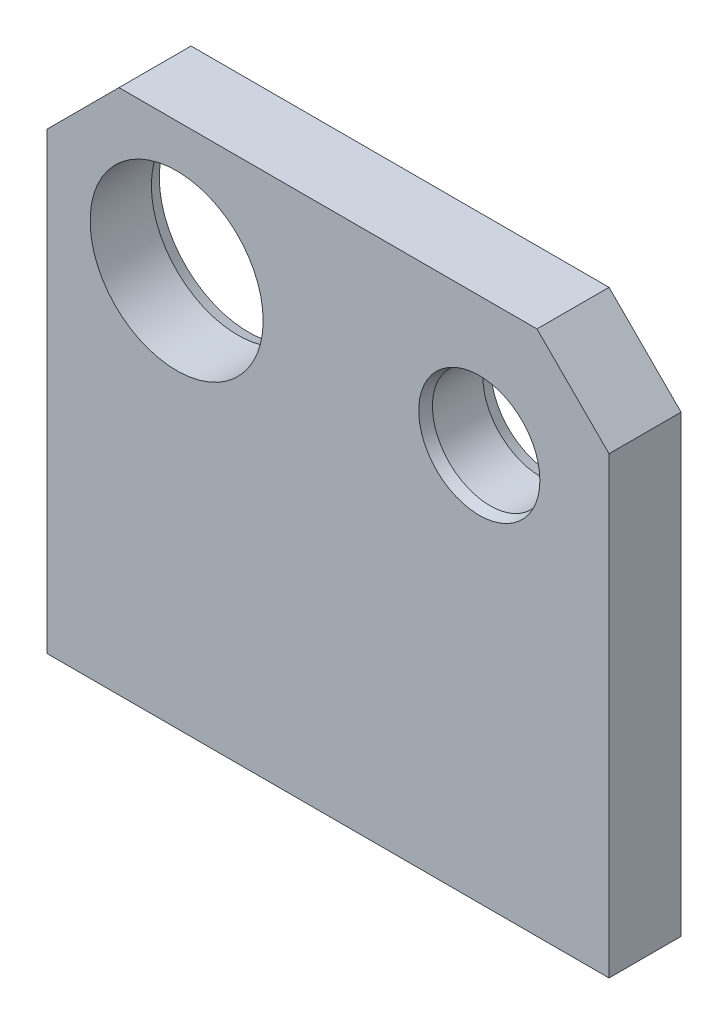
ISO-10303-21;
HEADER;
FILE_DESCRIPTION(('STEP AP214'),'2;1');
FILE_NAME('part.step','',(''),(''),'','','');
FILE_SCHEMA(('AUTOMOTIVE_DESIGN { 1 0 10303 214 1 1 1 1 }'));
ENDSEC;
DATA;
#1=APPLICATION_CONTEXT('core data for automotive mechanical design processes');
#2=APPLICATION_PROTOCOL_DEFINITION('international standard','automotive_design',2000,#1);
#3=PRODUCT_CONTEXT('',#1,'mechanical');
#4=PRODUCT('Part','Part','',(#3));
#5=PRODUCT_RELATED_PRODUCT_CATEGORY('part','',(#4));
#6=PRODUCT_DEFINITION_FORMATION('','',#4);
#7=PRODUCT_DEFINITION_CONTEXT('part definition',#1,'design');
#8=PRODUCT_DEFINITION('design','',#6,#7);
#9=PRODUCT_DEFINITION_SHAPE('','',#8);
#10=(LENGTH_UNIT() NAMED_UNIT(*) SI_UNIT(.MILLI.,.METRE.));
#11=(NAMED_UNIT(*) PLANE_ANGLE_UNIT() SI_UNIT($,.RADIAN.));
#12=(NAMED_UNIT(*) SI_UNIT($,.STERADIAN.) SOLID_ANGLE_UNIT());
#13=UNCERTAINTY_MEASURE_WITH_UNIT(LENGTH_MEASURE(1.E-05),#10,'distance_accuracy_value','');
#14=(GEOMETRIC_REPRESENTATION_CONTEXT(3) GLOBAL_UNCERTAINTY_ASSIGNED_CONTEXT((#13)) GLOBAL_UNIT_ASSIGNED_CONTEXT((#10,
#11,#12)) REPRESENTATION_CONTEXT('',''));
#15=CARTESIAN_POINT('',(0.,0.,0.));
#16=DIRECTION('',(0.,0.,1.));
#17=DIRECTION('',(1.,0.,0.));
#18=AXIS2_PLACEMENT_3D('',#15,#16,#17);
#19=CARTESIAN_POINT('',(0.,0.,9.99999999999999));
#20=DIRECTION('',(1.,0.,0.));
#21=DIRECTION('',(0.,0.,-1.));
#22=AXIS2_PLACEMENT_3D('',#19,#20,#21);
#23=PLANE('',#22);
#24=DIRECTION('',(0.,-1.,0.));
#25=VECTOR('',#24,1.);
#26=CARTESIAN_POINT('',(0.,0.,9.99999999999999));
#27=LINE('',#26,#25);
#28=CARTESIAN_POINT('',(0.,63.,9.99999999999999));
#29=VERTEX_POINT('',#28);
#30=CARTESIAN_POINT('',(0.,0.,9.99999999999999));
#31=VERTEX_POINT('',#30);
#32=EDGE_CURVE('E119',#29,#31,#27,.T.);
#33=ORIENTED_EDGE('',*,*,#32,.F.);
#34=DIRECTION('',(0.,0.,-1.));
#35=VECTOR('',#34,1.);
#36=CARTESIAN_POINT('',(0.,63.,9.99999999999999));
#37=LINE('',#36,#35);
#38=CARTESIAN_POINT('',(0.,63.,0.));
#39=VERTEX_POINT('',#38);
#40=EDGE_CURVE('E154',#29,#39,#37,.T.);
#41=ORIENTED_EDGE('',*,*,#40,.T.);
#42=DIRECTION('',(0.,-1.,0.));
#43=VECTOR('',#42,1.);
#44=CARTESIAN_POINT('',(0.,0.,0.));
#45=LINE('',#44,#43);
#46=CARTESIAN_POINT('',(0.,0.,0.));
#47=VERTEX_POINT('',#46);
#48=EDGE_CURVE('E118',#39,#47,#45,.T.);
#49=ORIENTED_EDGE('',*,*,#48,.T.);
#50=DIRECTION('',(0.,0.,-1.));
#51=VECTOR('',#50,1.);
#52=CARTESIAN_POINT('',(0.,0.,9.99999999999999));
#53=LINE('',#52,#51);
#54=EDGE_CURVE('E138',#31,#47,#53,.T.);
#55=ORIENTED_EDGE('',*,*,#54,.F.);
#56=EDGE_LOOP('',(#33,#41,#49,#55));
#57=FACE_BOUND('',#56,.T.);
#58=ADVANCED_FACE('F34',(#57),#23,.F.);
#59=CARTESIAN_POINT('',(0.,0.,9.99999999999999));
#60=DIRECTION('',(0.,1.,0.));
#61=DIRECTION('',(0.,0.,1.));
#62=AXIS2_PLACEMENT_3D('',#59,#60,#61);
#63=PLANE('',#62);
#64=CARTESIAN_POINT('',(5.,0.,5.));
#65=DIRECTION('',(0.,-1.,0.));
#66=DIRECTION('',(0.,0.,-1.));
#67=AXIS2_PLACEMENT_3D('',#64,#65,#66);
#68=CIRCLE('',#67,2.5);
#69=CARTESIAN_POINT('',(5.,0.,2.5));
#70=VERTEX_POINT('',#69);
#71=EDGE_CURVE('E105',#70,#70,#68,.T.);
#72=ORIENTED_EDGE('',*,*,#71,.F.);
#73=EDGE_LOOP('',(#72));
#74=FACE_BOUND('',#73,.T.);
#75=CARTESIAN_POINT('',(73.,0.,5.));
#76=DIRECTION('',(0.,-1.,0.));
#77=DIRECTION('',(0.,0.,-1.));
#78=AXIS2_PLACEMENT_3D('',#75,#76,#77);
#79=CIRCLE('',#78,2.5);
#80=CARTESIAN_POINT('',(73.,0.,2.5));
#81=VERTEX_POINT('',#80);
#82=EDGE_CURVE('E104',#81,#81,#79,.T.);
#83=ORIENTED_EDGE('',*,*,#82,.F.);
#84=EDGE_LOOP('',(#83));
#85=FACE_BOUND('',#84,.T.);
#86=DIRECTION('',(1.,0.,0.));
#87=VECTOR('',#86,1.);
#88=CARTESIAN_POINT('',(0.,0.,0.));
#89=LINE('',#88,#87);
#90=CARTESIAN_POINT('',(78.,0.,0.));
#91=VERTEX_POINT('',#90);
#92=EDGE_CURVE('E130',#47,#91,#89,.T.);
#93=ORIENTED_EDGE('',*,*,#92,.T.);
#94=DIRECTION('',(0.,0.,-1.));
#95=VECTOR('',#94,1.);
#96=CARTESIAN_POINT('',(78.,0.,9.99999999999999));
#97=LINE('',#96,#95);
#98=CARTESIAN_POINT('',(78.,0.,9.99999999999999));
#99=VERTEX_POINT('',#98);
#100=EDGE_CURVE('E128',#99,#91,#97,.T.);
#101=ORIENTED_EDGE('',*,*,#100,.F.);
#102=DIRECTION('',(1.,0.,0.));
#103=VECTOR('',#102,1.);
#104=CARTESIAN_POINT('',(0.,0.,9.99999999999999));
#105=LINE('',#104,#103);
#106=EDGE_CURVE('E121',#31,#99,#105,.T.);
#107=ORIENTED_EDGE('',*,*,#106,.F.);
#108=ORIENTED_EDGE('',*,*,#54,.T.);
#109=EDGE_LOOP('',(#93,#101,#107,#108));
#110=FACE_BOUND('',#109,.T.);
#111=ADVANCED_FACE('F184',(#74,#85,#110),#63,.F.);
#112=CARTESIAN_POINT('',(78.,0.,9.99999999999999));
#113=DIRECTION('',(-1.,0.,0.));
#114=DIRECTION('',(0.,0.,1.));
#115=AXIS2_PLACEMENT_3D('',#112,#113,#114);
#116=PLANE('',#115);
#117=DIRECTION('',(0.,1.,0.));
#118=VECTOR('',#117,1.);
#119=CARTESIAN_POINT('',(78.,0.,0.));
#120=LINE('',#119,#118);
#121=CARTESIAN_POINT('',(78.,63.,0.));
#122=VERTEX_POINT('',#121);
#123=EDGE_CURVE('E132',#91,#122,#120,.T.);
#124=ORIENTED_EDGE('',*,*,#123,.T.);
#125=DIRECTION('',(0.,0.,1.));
#126=VECTOR('',#125,1.);
#127=CARTESIAN_POINT('',(78.,63.,9.99999999999999));
#128=LINE('',#127,#126);
#129=CARTESIAN_POINT('',(78.,62.9999999999999,9.99999999999999));
#130=VERTEX_POINT('',#129);
#131=EDGE_CURVE('E57',#122,#130,#128,.T.);
#132=ORIENTED_EDGE('',*,*,#131,.T.);
#133=DIRECTION('',(0.,1.,0.));
#134=VECTOR('',#133,1.);
#135=CARTESIAN_POINT('',(78.,0.,9.99999999999999));
#136=LINE('',#135,#134);
#137=EDGE_CURVE('E124',#99,#130,#136,.T.);
#138=ORIENTED_EDGE('',*,*,#137,.F.);
#139=ORIENTED_EDGE('',*,*,#100,.T.);
#140=EDGE_LOOP('',(#124,#132,#138,#139));
#141=FACE_BOUND('',#140,.T.);
#142=ADVANCED_FACE('F190',(#141),#116,.F.);
#143=CARTESIAN_POINT('',(0.,73.,9.99999999999999));
#144=DIRECTION('',(0.,-1.,0.));
#145=DIRECTION('',(0.,0.,-1.));
#146=AXIS2_PLACEMENT_3D('',#143,#144,#145);
#147=PLANE('',#146);
#148=DIRECTION('',(-1.,0.,0.));
#149=VECTOR('',#148,1.);
#150=CARTESIAN_POINT('',(0.,73.,9.99999999999999));
#151=LINE('',#150,#149);
#152=CARTESIAN_POINT('',(68.,73.,9.99999999999999));
#153=VERTEX_POINT('',#152);
#154=CARTESIAN_POINT('',(10.,73.,9.99999999999999));
#155=VERTEX_POINT('',#154);
#156=EDGE_CURVE('E126',#153,#155,#151,.T.);
#157=ORIENTED_EDGE('',*,*,#156,.F.);
#158=DIRECTION('',(0.,0.,-1.));
#159=VECTOR('',#158,1.);
#160=CARTESIAN_POINT('',(68.,73.,9.99999999999999));
#161=LINE('',#160,#159);
#162=CARTESIAN_POINT('',(68.,73.,0.));
#163=VERTEX_POINT('',#162);
#164=EDGE_CURVE('E143',#153,#163,#161,.T.);
#165=ORIENTED_EDGE('',*,*,#164,.T.);
#166=DIRECTION('',(-1.,0.,0.));
#167=VECTOR('',#166,1.);
#168=CARTESIAN_POINT('',(0.,73.,0.));
#169=LINE('',#168,#167);
#170=CARTESIAN_POINT('',(10.,73.,0.));
#171=VERTEX_POINT('',#170);
#172=EDGE_CURVE('E122',#163,#171,#169,.T.);
#173=ORIENTED_EDGE('',*,*,#172,.T.);
#174=DIRECTION('',(0.,0.,1.));
#175=VECTOR('',#174,1.);
#176=CARTESIAN_POINT('',(10.,73.,9.99999999999999));
#177=LINE('',#176,#175);
#178=EDGE_CURVE('E141',#171,#155,#177,.T.);
#179=ORIENTED_EDGE('',*,*,#178,.T.);
#180=EDGE_LOOP('',(#157,#165,#173,#179));
#181=FACE_BOUND('',#180,.T.);
#182=ADVANCED_FACE('F225',(#181),#147,.F.);
#183=CARTESIAN_POINT('',(0.,73.,9.99999999999999));
#184=DIRECTION('',(0.,0.,-1.));
#185=DIRECTION('',(-1.,0.,0.));
#186=AXIS2_PLACEMENT_3D('',#183,#184,#185);
#187=PLANE('',#186);
#188=CARTESIAN_POINT('',(60.,55.,9.99999999999999));
#189=DIRECTION('',(0.,0.,-1.));
#190=DIRECTION('',(-1.,0.,0.));
#191=AXIS2_PLACEMENT_3D('',#188,#189,#190);
#192=CIRCLE('',#191,8.40642378864666);
#193=CARTESIAN_POINT('',(68.4064237886467,55.,10.));
#194=VERTEX_POINT('',#193);
#195=EDGE_CURVE('E11',#194,#194,#192,.T.);
#196=ORIENTED_EDGE('',*,*,#195,.T.);
#197=EDGE_LOOP('',(#196));
#198=FACE_BOUND('',#197,.T.);
#199=CARTESIAN_POINT('',(18.,55.,9.99999999999999));
#200=DIRECTION('',(0.,0.,1.));
#201=DIRECTION('',(1.,0.,0.));
#202=AXIS2_PLACEMENT_3D('',#199,#200,#201);
#203=CIRCLE('',#202,12.0065);
#204=CARTESIAN_POINT('',(30.0065,55.,9.99999999999999));
#205=VERTEX_POINT('',#204);
#206=EDGE_CURVE('E115',#205,#205,#203,.T.);
#207=ORIENTED_EDGE('',*,*,#206,.F.);
#208=EDGE_LOOP('',(#207));
#209=FACE_BOUND('',#208,.T.);
#210=ORIENTED_EDGE('',*,*,#137,.T.);
#211=DIRECTION('',(0.707106781186546,-0.70710678118655,0.));
#212=VECTOR('',#211,1.);
#213=CARTESIAN_POINT('',(68.,73.,9.99999999999999));
#214=LINE('',#213,#212);
#215=EDGE_CURVE('E152',#130,#153,#214,.F.);
#216=ORIENTED_EDGE('',*,*,#215,.T.);
#217=ORIENTED_EDGE('',*,*,#156,.T.);
#218=DIRECTION('',(0.70710678118655,0.707106781186546,0.));
#219=VECTOR('',#218,1.);
#220=CARTESIAN_POINT('',(0.,63.,9.99999999999999));
#221=LINE('',#220,#219);
#222=EDGE_CURVE('E49',#155,#29,#221,.F.);
#223=ORIENTED_EDGE('',*,*,#222,.T.);
#224=ORIENTED_EDGE('',*,*,#32,.T.);
#225=ORIENTED_EDGE('',*,*,#106,.T.);
#226=EDGE_LOOP('',(#210,#216,#217,#223,#224,#225));
#227=FACE_BOUND('',#226,.T.);
#228=ADVANCED_FACE('F215',(#198,#209,#227),#187,.F.);
#229=CARTESIAN_POINT('',(0.,73.,0.));
#230=DIRECTION('',(0.,0.,-1.));
#231=DIRECTION('',(-1.,0.,0.));
#232=AXIS2_PLACEMENT_3D('',#229,#230,#231);
#233=PLANE('',#232);
#234=CARTESIAN_POINT('',(60.,55.,0.));
#235=DIRECTION('',(0.,0.,-1.));
#236=DIRECTION('',(-1.,0.,0.));
#237=AXIS2_PLACEMENT_3D('',#234,#235,#236);
#238=CIRCLE('',#237,8.40642378864666);
#239=CARTESIAN_POINT('',(51.5935762113533,55.,0.));
#240=VERTEX_POINT('',#239);
#241=EDGE_CURVE('E160',#240,#240,#238,.F.);
#242=ORIENTED_EDGE('',*,*,#241,.T.);
#243=EDGE_LOOP('',(#242));
#244=FACE_BOUND('',#243,.T.);
#245=CARTESIAN_POINT('',(18.,55.,0.));
#246=DIRECTION('',(0.,0.,-1.));
#247=DIRECTION('',(-1.,0.,0.));
#248=AXIS2_PLACEMENT_3D('',#245,#246,#247);
#249=CIRCLE('',#248,12.4084237886467);
#250=CARTESIAN_POINT('',(5.59157621135334,55.,0.));
#251=VERTEX_POINT('',#250);
#252=EDGE_CURVE('E157',#251,#251,#249,.F.);
#253=ORIENTED_EDGE('',*,*,#252,.T.);
#254=EDGE_LOOP('',(#253));
#255=FACE_BOUND('',#254,.T.);
#256=ORIENTED_EDGE('',*,*,#172,.F.);
#257=DIRECTION('',(-0.707106781186546,0.70710678118655,0.));
#258=VECTOR('',#257,1.);
#259=CARTESIAN_POINT('',(34.0000000000002,107.,0.));
#260=LINE('',#259,#258);
#261=EDGE_CURVE('E148',#163,#122,#260,.F.);
#262=ORIENTED_EDGE('',*,*,#261,.T.);
#263=ORIENTED_EDGE('',*,*,#123,.F.);
#264=ORIENTED_EDGE('',*,*,#92,.F.);
#265=ORIENTED_EDGE('',*,*,#48,.F.);
#266=DIRECTION('',(-0.70710678118655,-0.707106781186546,0.));
#267=VECTOR('',#266,1.);
#268=CARTESIAN_POINT('',(4.99999999999999,68.,0.));
#269=LINE('',#268,#267);
#270=EDGE_CURVE('E146',#39,#171,#269,.F.);
#271=ORIENTED_EDGE('',*,*,#270,.T.);
#272=EDGE_LOOP('',(#256,#262,#263,#264,#265,#271));
#273=FACE_BOUND('',#272,.T.);
#274=ADVANCED_FACE('F211',(#244,#255,#273),#233,.T.);
#275=CARTESIAN_POINT('',(18.,55.,0.));
#276=DIRECTION('',(0.,0.,1.));
#277=DIRECTION('',(1.,0.,0.));
#278=AXIS2_PLACEMENT_3D('',#275,#276,#277);
#279=CYLINDRICAL_SURFACE('',#278,12.0065);
#280=CARTESIAN_POINT('',(18.,55.,1.49999999999993));
#281=DIRECTION('',(0.,0.,-1.));
#282=DIRECTION('',(-1.,0.,0.));
#283=AXIS2_PLACEMENT_3D('',#280,#281,#282);
#284=CIRCLE('',#283,12.0065);
#285=CARTESIAN_POINT('',(5.9935,55.,1.49999999999993));
#286=VERTEX_POINT('',#285);
#287=EDGE_CURVE('E166',#286,#286,#284,.T.);
#288=ORIENTED_EDGE('',*,*,#287,.T.);
#289=EDGE_LOOP('',(#288));
#290=FACE_BOUND('',#289,.T.);
#291=ORIENTED_EDGE('',*,*,#206,.T.);
#292=EDGE_LOOP('',(#291));
#293=FACE_BOUND('',#292,.T.);
#294=ADVANCED_FACE('F214',(#290,#293),#279,.F.);
#295=CARTESIAN_POINT('',(73.,15.,5.));
#296=DIRECTION('',(0.,-1.,0.));
#297=DIRECTION('',(0.,0.,-1.));
#298=AXIS2_PLACEMENT_3D('',#295,#296,#297);
#299=CONICAL_SURFACE('',#298,2.5,1.02974425867665);
#300=CARTESIAN_POINT('',(73.,16.5021515475689,5.));
#301=VERTEX_POINT('',#300);
#302=VERTEX_LOOP('',#301);
#303=FACE_BOUND('',#302,.T.);
#304=CARTESIAN_POINT('',(73.,15.,5.));
#305=DIRECTION('',(0.,-1.,0.));
#306=DIRECTION('',(0.,0.,-1.));
#307=AXIS2_PLACEMENT_3D('',#304,#305,#306);
#308=CIRCLE('',#307,2.5);
#309=CARTESIAN_POINT('',(73.,15.,2.5));
#310=VERTEX_POINT('',#309);
#311=EDGE_CURVE('E108',#310,#310,#308,.T.);
#312=ORIENTED_EDGE('',*,*,#311,.T.);
#313=EDGE_LOOP('',(#312));
#314=FACE_BOUND('',#313,.T.);
#315=ADVANCED_FACE('F245',(#303,#314),#299,.F.);
#316=CARTESIAN_POINT('',(73.,0.,5.));
#317=DIRECTION('',(0.,-1.,0.));
#318=DIRECTION('',(0.,0.,-1.));
#319=AXIS2_PLACEMENT_3D('',#316,#317,#318);
#320=CYLINDRICAL_SURFACE('',#319,2.5);
#321=ORIENTED_EDGE('',*,*,#311,.F.);
#322=EDGE_LOOP('',(#321));
#323=FACE_BOUND('',#322,.T.);
#324=ORIENTED_EDGE('',*,*,#82,.T.);
#325=EDGE_LOOP('',(#324));
#326=FACE_BOUND('',#325,.T.);
#327=ADVANCED_FACE('F98',(#323,#326),#320,.F.);
#328=CARTESIAN_POINT('',(5.,15.,5.));
#329=DIRECTION('',(0.,-1.,0.));
#330=DIRECTION('',(0.,0.,-1.));
#331=AXIS2_PLACEMENT_3D('',#328,#329,#330);
#332=CONICAL_SURFACE('',#331,2.5,1.02974425867665);
#333=CARTESIAN_POINT('',(5.,16.5021515475689,5.));
#334=VERTEX_POINT('',#333);
#335=VERTEX_LOOP('',#334);
#336=FACE_BOUND('',#335,.T.);
#337=CARTESIAN_POINT('',(5.,15.,5.));
#338=DIRECTION('',(0.,-1.,0.));
#339=DIRECTION('',(0.,0.,-1.));
#340=AXIS2_PLACEMENT_3D('',#337,#338,#339);
#341=CIRCLE('',#340,2.5);
#342=CARTESIAN_POINT('',(5.,15.,2.50000000000001));
#343=VERTEX_POINT('',#342);
#344=EDGE_CURVE('E102',#343,#343,#341,.T.);
#345=ORIENTED_EDGE('',*,*,#344,.T.);
#346=EDGE_LOOP('',(#345));
#347=FACE_BOUND('',#346,.T.);
#348=ADVANCED_FACE('F94',(#336,#347),#332,.F.);
#349=CARTESIAN_POINT('',(5.,0.,5.));
#350=DIRECTION('',(0.,-1.,0.));
#351=DIRECTION('',(0.,0.,-1.));
#352=AXIS2_PLACEMENT_3D('',#349,#350,#351);
#353=CYLINDRICAL_SURFACE('',#352,2.5);
#354=ORIENTED_EDGE('',*,*,#344,.F.);
#355=EDGE_LOOP('',(#354));
#356=FACE_BOUND('',#355,.T.);
#357=ORIENTED_EDGE('',*,*,#71,.T.);
#358=EDGE_LOOP('',(#357));
#359=FACE_BOUND('',#358,.T.);
#360=ADVANCED_FACE('F97',(#356,#359),#353,.F.);
#361=CARTESIAN_POINT('',(60.,55.,0.));
#362=DIRECTION('',(0.,0.,1.));
#363=DIRECTION('',(1.,0.,0.));
#364=AXIS2_PLACEMENT_3D('',#361,#362,#363);
#365=CYLINDRICAL_SURFACE('',#364,8.0045);
#366=CARTESIAN_POINT('',(60.,55.,8.50000000000006));
#367=DIRECTION('',(0.,0.,-1.));
#368=DIRECTION('',(-1.,0.,0.));
#369=AXIS2_PLACEMENT_3D('',#366,#367,#368);
#370=CIRCLE('',#369,8.0045);
#371=CARTESIAN_POINT('',(68.0045,55.,8.50000000000006));
#372=VERTEX_POINT('',#371);
#373=EDGE_CURVE('E42',#372,#372,#370,.F.);
#374=ORIENTED_EDGE('',*,*,#373,.T.);
#375=EDGE_LOOP('',(#374));
#376=FACE_BOUND('',#375,.T.);
#377=CARTESIAN_POINT('',(60.,55.,1.49999999999995));
#378=DIRECTION('',(0.,0.,-1.));
#379=DIRECTION('',(-1.,0.,0.));
#380=AXIS2_PLACEMENT_3D('',#377,#378,#379);
#381=CIRCLE('',#380,8.0045);
#382=CARTESIAN_POINT('',(51.9955,55.,1.49999999999995));
#383=VERTEX_POINT('',#382);
#384=EDGE_CURVE('E163',#383,#383,#381,.T.);
#385=ORIENTED_EDGE('',*,*,#384,.T.);
#386=EDGE_LOOP('',(#385));
#387=FACE_BOUND('',#386,.T.);
#388=ADVANCED_FACE('F171',(#376,#387),#365,.F.);
#389=CARTESIAN_POINT('',(68.,73.,9.99999999999999));
#390=DIRECTION('',(-0.707106781186549,-0.707106781186545,0.));
#391=DIRECTION('',(0.707106781186546,-0.70710678118655,0.));
#392=AXIS2_PLACEMENT_3D('',#389,#390,#391);
#393=PLANE('',#392);
#394=ORIENTED_EDGE('',*,*,#215,.F.);
#395=ORIENTED_EDGE('',*,*,#131,.F.);
#396=ORIENTED_EDGE('',*,*,#261,.F.);
#397=ORIENTED_EDGE('',*,*,#164,.F.);
#398=EDGE_LOOP('',(#394,#395,#396,#397));
#399=FACE_BOUND('',#398,.T.);
#400=ADVANCED_FACE('F195',(#399),#393,.F.);
#401=CARTESIAN_POINT('',(0.,63.,9.99999999999999));
#402=DIRECTION('',(0.707106781186545,-0.707106781186549,0.));
#403=DIRECTION('',(0.70710678118655,0.707106781186546,0.));
#404=AXIS2_PLACEMENT_3D('',#401,#402,#403);
#405=PLANE('',#404);
#406=ORIENTED_EDGE('',*,*,#222,.F.);
#407=ORIENTED_EDGE('',*,*,#178,.F.);
#408=ORIENTED_EDGE('',*,*,#270,.F.);
#409=ORIENTED_EDGE('',*,*,#40,.F.);
#410=EDGE_LOOP('',(#406,#407,#408,#409));
#411=FACE_BOUND('',#410,.T.);
#412=ADVANCED_FACE('F198',(#411),#405,.F.);
#413=CARTESIAN_POINT('',(60.,55.,0.));
#414=DIRECTION('',(0.,0.,-1.));
#415=DIRECTION('',(-1.,0.,0.));
#416=AXIS2_PLACEMENT_3D('',#413,#414,#415);
#417=CONICAL_SURFACE('',#416,8.40642378864666,0.261799387799142);
#418=ORIENTED_EDGE('',*,*,#384,.F.);
#419=EDGE_LOOP('',(#418));
#420=FACE_BOUND('',#419,.T.);
#421=ORIENTED_EDGE('',*,*,#241,.F.);
#422=EDGE_LOOP('',(#421));
#423=FACE_BOUND('',#422,.T.);
#424=ADVANCED_FACE('F180',(#420,#423),#417,.F.);
#425=CARTESIAN_POINT('',(18.,55.,0.));
#426=DIRECTION('',(0.,0.,-1.));
#427=DIRECTION('',(-1.,0.,0.));
#428=AXIS2_PLACEMENT_3D('',#425,#426,#427);
#429=CONICAL_SURFACE('',#428,12.4084237886467,0.261799387799147);
#430=CARTESIAN_POINT('',(5.9935,55.,1.49999999999993));
#431=CARTESIAN_POINT('',(5.98931329386826,55.,1.48437499999993));
#432=CARTESIAN_POINT('',(5.98512658773653,55.,1.46874999999993));
#433=CARTESIAN_POINT('',(5.97675317547306,55.,1.43749999999993));
#434=CARTESIAN_POINT('',(5.97256646934132,55.,1.42187499999994));
#435=CARTESIAN_POINT('',(5.96419305707785,55.,1.39062499999994));
#436=CARTESIAN_POINT('',(5.96000635094611,55.,1.37499999999994));
#437=CARTESIAN_POINT('',(5.95163293868264,55.,1.34374999999994));
#438=CARTESIAN_POINT('',(5.9474462325509,55.,1.32812499999994));
#439=CARTESIAN_POINT('',(5.93907282028743,55.,1.29687499999994));
#440=CARTESIAN_POINT('',(5.9348861141557,55.,1.28124999999994));
#441=CARTESIAN_POINT('',(5.92651270189222,55.,1.24999999999994));
#442=CARTESIAN_POINT('',(5.92232599576049,55.,1.23437499999994));
#443=CARTESIAN_POINT('',(5.91395258349701,55.,1.20312499999995));
#444=CARTESIAN_POINT('',(5.90976587736528,55.,1.18749999999995));
#445=CARTESIAN_POINT('',(5.90139246510181,55.,1.15624999999995));
#446=CARTESIAN_POINT('',(5.89720575897007,55.,1.14062499999995));
#447=CARTESIAN_POINT('',(5.8888323467066,55.,1.10937499999995));
#448=CARTESIAN_POINT('',(5.88464564057486,55.,1.09374999999995));
#449=CARTESIAN_POINT('',(5.87627222831139,55.,1.06249999999995));
#450=CARTESIAN_POINT('',(5.87208552217965,55.,1.04687499999995));
#451=CARTESIAN_POINT('',(5.86371210991618,55.,1.01562499999995));
#452=CARTESIAN_POINT('',(5.85952540378445,55.,0.999999999999955));
#453=CARTESIAN_POINT('',(5.85115199152097,55.,0.968749999999956));
#454=CARTESIAN_POINT('',(5.84696528538924,55.,0.953124999999957));
#455=CARTESIAN_POINT('',(5.83859187312577,55.,0.921874999999958));
#456=CARTESIAN_POINT('',(5.83440516699403,55.,0.906249999999959));
#457=CARTESIAN_POINT('',(5.82603175473056,55.,0.87499999999996));
#458=CARTESIAN_POINT('',(5.82184504859882,55.,0.859374999999961));
#459=CARTESIAN_POINT('',(5.81347163633535,55.,0.828124999999963));
#460=CARTESIAN_POINT('',(5.80928493020361,55.,0.812499999999963));
#461=CARTESIAN_POINT('',(5.80091151794014,55.,0.781249999999965));
#462=CARTESIAN_POINT('',(5.79672481180841,55.,0.765624999999965));
#463=CARTESIAN_POINT('',(5.78835139954493,55.,0.734374999999967));
#464=CARTESIAN_POINT('',(5.7841646934132,55.,0.718749999999967));
#465=CARTESIAN_POINT('',(5.77579128114973,55.,0.687499999999969));
#466=CARTESIAN_POINT('',(5.77160457501799,55.,0.67187499999997));
#467=CARTESIAN_POINT('',(5.76323116275452,55.,0.640624999999971));
#468=CARTESIAN_POINT('',(5.75904445662278,55.,0.624999999999972));
#469=CARTESIAN_POINT('',(5.75067104435931,55.,0.593749999999973));
#470=CARTESIAN_POINT('',(5.74648433822757,55.,0.578124999999974));
#471=CARTESIAN_POINT('',(5.7381109259641,55.,0.546874999999975));
#472=CARTESIAN_POINT('',(5.73392421983237,55.,0.531249999999976));
#473=CARTESIAN_POINT('',(5.72555080756889,55.,0.499999999999977));
#474=CARTESIAN_POINT('',(5.72136410143716,55.,0.484374999999978));
#475=CARTESIAN_POINT('',(5.71299068917368,55.,0.45312499999998));
#476=CARTESIAN_POINT('',(5.70880398304195,55.,0.43749999999998));
#477=CARTESIAN_POINT('',(5.70043057077848,55.,0.406249999999982));
#478=CARTESIAN_POINT('',(5.69624386464674,55.,0.390624999999982));
#479=CARTESIAN_POINT('',(5.68787045238327,55.,0.359374999999984));
#480=CARTESIAN_POINT('',(5.68368374625153,55.,0.343749999999984));
#481=CARTESIAN_POINT('',(5.67531033398806,55.,0.312499999999986));
#482=CARTESIAN_POINT('',(5.67112362785632,55.,0.296874999999986));
#483=CARTESIAN_POINT('',(5.66275021559285,55.,0.265624999999988));
#484=CARTESIAN_POINT('',(5.65856350946112,55.,0.249999999999989));
#485=CARTESIAN_POINT('',(5.65019009719764,55.,0.21874999999999));
#486=CARTESIAN_POINT('',(5.64600339106591,55.,0.203124999999991));
#487=CARTESIAN_POINT('',(5.63762997880244,55.,0.171874999999992));
#488=CARTESIAN_POINT('',(5.6334432726707,55.,0.156249999999993));
#489=CARTESIAN_POINT('',(5.62506986040723,55.,0.124999999999994));
#490=CARTESIAN_POINT('',(5.62088315427549,55.,0.109374999999995));
#491=CARTESIAN_POINT('',(5.61250974201202,55.,0.0781249999999964));
#492=CARTESIAN_POINT('',(5.60832303588028,55.,0.0624999999999971));
#493=CARTESIAN_POINT('',(5.59994962361681,55.,0.0312499999999986));
#494=CARTESIAN_POINT('',(5.59576291748507,55.,0.0156249999999994));
#495=CARTESIAN_POINT('',(5.59157621135334,55.,0.));
#496=B_SPLINE_CURVE_WITH_KNOTS('',3,(#430,#431,#432,#433,#434,#435,#436,#437,#438,#439,#440,
#441,#442,#443,#444,#445,#446,#447,#448,#449,#450,#451,#452,#453,#454,#455,#456,#457,#458,#459,
#460,#461,#462,#463,#464,#465,#466,#467,#468,#469,#470,#471,#472,#473,#474,#475,#476,#477,#478,
#479,#480,#481,#482,#483,#484,#485,#486,#487,#488,#489,#490,#491,#492,#493,#494,#495),
.UNSPECIFIED.,.F.,.F.,(4,2,2,2,2,2,2,2,2,2,2,2,2,2,2,2,2,2,2,2,2,2,2,2,2,2,2,2,2,2,2,2,4),(0.,
0.0485285709567205,0.0970571419134406,0.145585712870161,0.194114283826882,0.242642854783602,
0.291171425740323,0.339699996697043,0.388228567653763,0.436757138610484,0.485285709567204,
0.533814280523925,0.582342851480645,0.630871422437366,0.679399993394086,0.727928564350807,
0.776457135307527,0.824985706264247,0.873514277220968,0.922042848177688,0.970571419134409,
1.01909999009113,1.06762856104785,1.11615713200457,1.16468570296129,1.21321427391801,
1.26174284487473,1.31027141583145,1.35879998678817,1.40732855774489,1.45585712870161,
1.50438569965833,1.55291427061505),.UNSPECIFIED.);
#497=EDGE_CURVE('BSEAM175',#286,#251,#496,.T.);
#498=ORIENTED_EDGE('',*,*,#287,.F.);
#499=ORIENTED_EDGE('',*,*,#252,.F.);
#500=ORIENTED_EDGE('',*,*,#497,.T.);
#501=ORIENTED_EDGE('',*,*,#497,.F.);
#502=EDGE_LOOP('',(#498,#500,#499,#501));
#503=FACE_BOUND('',#502,.T.);
#504=ADVANCED_FACE('F175',(#503),#429,.F.);
#505=CARTESIAN_POINT('',(60.,55.,8.50000000000006));
#506=DIRECTION('',(0.,0.,1.));
#507=DIRECTION('',(1.,0.,0.));
#508=AXIS2_PLACEMENT_3D('',#505,#506,#507);
#509=CONICAL_SURFACE('',#508,8.0045,0.261799387799144);
#510=CARTESIAN_POINT('',(68.4064237886467,55.,10.));
#511=CARTESIAN_POINT('',(68.4022370825149,55.,9.984375));
#512=CARTESIAN_POINT('',(68.3980503763832,55.,9.96875));
#513=CARTESIAN_POINT('',(68.3896769641197,55.,9.9375));
#514=CARTESIAN_POINT('',(68.385490257988,55.,9.921875));
#515=CARTESIAN_POINT('',(68.3771168457245,55.,9.890625));
#516=CARTESIAN_POINT('',(68.3729301395928,55.,9.875));
#517=CARTESIAN_POINT('',(68.3645567273293,55.,9.84375));
#518=CARTESIAN_POINT('',(68.3603700211976,55.,9.828125));
#519=CARTESIAN_POINT('',(68.3519966089341,55.,9.79687500000001));
#520=CARTESIAN_POINT('',(68.3478099028024,55.,9.78125000000001));
#521=CARTESIAN_POINT('',(68.3394364905389,55.,9.75000000000001));
#522=CARTESIAN_POINT('',(68.3352497844072,55.,9.73437500000001));
#523=CARTESIAN_POINT('',(68.3268763721437,55.,9.70312500000001));
#524=CARTESIAN_POINT('',(68.3226896660119,55.,9.68750000000001));
#525=CARTESIAN_POINT('',(68.3143162537485,55.,9.65625000000001));
#526=CARTESIAN_POINT('',(68.3101295476167,55.,9.64062500000001));
#527=CARTESIAN_POINT('',(68.3017561353532,55.,9.60937500000002));
#528=CARTESIAN_POINT('',(68.2975694292215,55.,9.59375000000002));
#529=CARTESIAN_POINT('',(68.289196016958,55.,9.56250000000002));
#530=CARTESIAN_POINT('',(68.2850093108263,55.,9.54687500000002));
#531=CARTESIAN_POINT('',(68.2766358985628,55.,9.51562500000002));
#532=CARTESIAN_POINT('',(68.2724491924311,55.,9.50000000000002));
#533=CARTESIAN_POINT('',(68.2640757801676,55.,9.46875000000002));
#534=CARTESIAN_POINT('',(68.2598890740359,55.,9.45312500000002));
#535=CARTESIAN_POINT('',(68.2515156617724,55.,9.42187500000002));
#536=CARTESIAN_POINT('',(68.2473289556407,55.,9.40625000000002));
#537=CARTESIAN_POINT('',(68.2389555433772,55.,9.37500000000002));
#538=CARTESIAN_POINT('',(68.2347688372455,55.,9.35937500000002));
#539=CARTESIAN_POINT('',(68.226395424982,55.,9.32812500000002));
#540=CARTESIAN_POINT('',(68.2222087188503,55.,9.31250000000003));
#541=CARTESIAN_POINT('',(68.2138353065868,55.,9.28125000000003));
#542=CARTESIAN_POINT('',(68.2096486004551,55.,9.26562500000003));
#543=CARTESIAN_POINT('',(68.2012751881916,55.,9.23437500000003));
#544=CARTESIAN_POINT('',(68.1970884820599,55.,9.21875000000003));
#545=CARTESIAN_POINT('',(68.1887150697964,55.,9.18750000000003));
#546=CARTESIAN_POINT('',(68.1845283636647,55.,9.17187500000003));
#547=CARTESIAN_POINT('',(68.1761549514012,55.,9.14062500000003));
#548=CARTESIAN_POINT('',(68.1719682452694,55.,9.12500000000004));
#549=CARTESIAN_POINT('',(68.163594833006,55.,9.09375000000004));
#550=CARTESIAN_POINT('',(68.1594081268742,55.,9.07812500000004));
#551=CARTESIAN_POINT('',(68.1510347146108,55.,9.04687500000004));
#552=CARTESIAN_POINT('',(68.146848008479,55.,9.03125000000004));
#553=CARTESIAN_POINT('',(68.1384745962156,55.,9.00000000000004));
#554=CARTESIAN_POINT('',(68.1342878900838,55.,8.98437500000004));
#555=CARTESIAN_POINT('',(68.1259144778203,55.,8.95312500000004));
#556=CARTESIAN_POINT('',(68.1217277716886,55.,8.93750000000004));
#557=CARTESIAN_POINT('',(68.1133543594251,55.,8.90625000000004));
#558=CARTESIAN_POINT('',(68.1091676532934,55.,8.89062500000005));
#559=CARTESIAN_POINT('',(68.1007942410299,55.,8.85937500000005));
#560=CARTESIAN_POINT('',(68.0966075348982,55.,8.84375000000005));
#561=CARTESIAN_POINT('',(68.0882341226347,55.,8.81250000000005));
#562=CARTESIAN_POINT('',(68.084047416503,55.,8.79687500000005));
#563=CARTESIAN_POINT('',(68.0756740042395,55.,8.76562500000005));
#564=CARTESIAN_POINT('',(68.0714872981078,55.,8.75000000000005));
#565=CARTESIAN_POINT('',(68.0631138858443,55.,8.71875000000006));
#566=CARTESIAN_POINT('',(68.0589271797126,55.,8.70312500000006));
#567=CARTESIAN_POINT('',(68.0505537674491,55.,8.67187500000006));
#568=CARTESIAN_POINT('',(68.0463670613174,55.,8.65625000000006));
#569=CARTESIAN_POINT('',(68.0379936490539,55.,8.62500000000006));
#570=CARTESIAN_POINT('',(68.0338069429222,55.,8.60937500000006));
#571=CARTESIAN_POINT('',(68.0254335306587,55.,8.57812500000006));
#572=CARTESIAN_POINT('',(68.0212468245269,55.,8.56250000000006));
#573=CARTESIAN_POINT('',(68.0128734122635,55.,8.53125000000006));
#574=CARTESIAN_POINT('',(68.0086867061317,55.,8.51562500000006));
#575=CARTESIAN_POINT('',(68.0045,55.,8.50000000000006));
#576=B_SPLINE_CURVE_WITH_KNOTS('',3,(#510,#511,#512,#513,#514,#515,#516,#517,#518,#519,#520,
#521,#522,#523,#524,#525,#526,#527,#528,#529,#530,#531,#532,#533,#534,#535,#536,#537,#538,#539,
#540,#541,#542,#543,#544,#545,#546,#547,#548,#549,#550,#551,#552,#553,#554,#555,#556,#557,#558,
#559,#560,#561,#562,#563,#564,#565,#566,#567,#568,#569,#570,#571,#572,#573,#574,#575),
.UNSPECIFIED.,.F.,.F.,(4,2,2,2,2,2,2,2,2,2,2,2,2,2,2,2,2,2,2,2,2,2,2,2,2,2,2,2,2,2,2,2,4),(0.,
0.04852857095672,0.0970571419134401,0.145585712870164,0.194114283826882,0.242642854783602,
0.291171425740322,0.339699996697042,0.388228567653764,0.436757138610484,0.485285709567204,
0.533814280523924,0.582342851480646,0.630871422437366,0.679399993394086,0.727928564350806,
0.776457135307524,0.824985706264248,0.873514277220968,0.922042848177688,0.970571419134406,
1.01909999009113,1.06762856104785,1.11615713200457,1.16468570296129,1.21321427391801,
1.26174284487473,1.31027141583145,1.35879998678817,1.40732855774489,1.45585712870161,
1.50438569965833,1.55291427061505),.UNSPECIFIED.);
#577=EDGE_CURVE('BSEAM36',#194,#372,#576,.T.);
#578=ORIENTED_EDGE('',*,*,#195,.F.);
#579=ORIENTED_EDGE('',*,*,#373,.F.);
#580=ORIENTED_EDGE('',*,*,#577,.T.);
#581=ORIENTED_EDGE('',*,*,#577,.F.);
#582=EDGE_LOOP('',(#578,#580,#579,#581));
#583=FACE_BOUND('',#582,.T.);
#584=ADVANCED_FACE('F36',(#583),#509,.F.);
#585=CLOSED_SHELL('',(#58,#111,#142,#182,#228,#274,#294,#315,#327,#348,#360,#388,#400,#412,#424,
#504,#584));
#586=MANIFOLD_SOLID_BREP('B2',#585);
#587=ADVANCED_BREP_SHAPE_REPRESENTATION('',(#18,#586),#14);
#588=SHAPE_DEFINITION_REPRESENTATION(#9,#587);
ENDSEC;
END-ISO-10303-21;
